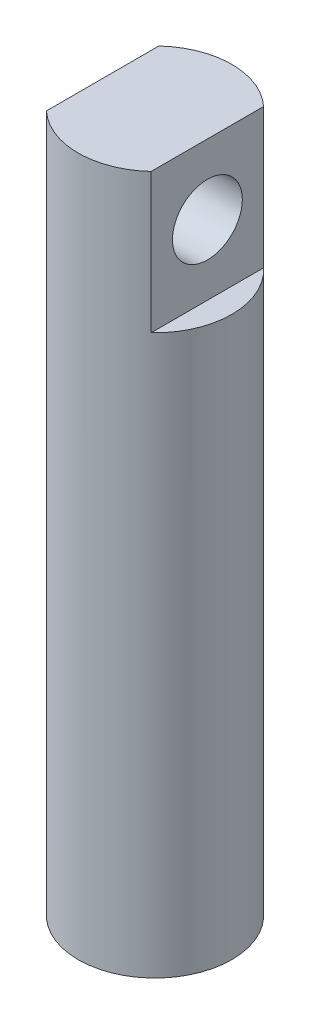
ISO-10303-21;
HEADER;
FILE_DESCRIPTION(('STEP AP214'),'2;1');
FILE_NAME('part.step','',(''),(''),'','','');
FILE_SCHEMA(('AUTOMOTIVE_DESIGN { 1 0 10303 214 1 1 1 1 }'));
ENDSEC;
DATA;
#1=APPLICATION_CONTEXT('core data for automotive mechanical design processes');
#2=APPLICATION_PROTOCOL_DEFINITION('international standard','automotive_design',2000,#1);
#3=PRODUCT_CONTEXT('',#1,'mechanical');
#4=PRODUCT('Part','Part','',(#3));
#5=PRODUCT_RELATED_PRODUCT_CATEGORY('part','',(#4));
#6=PRODUCT_DEFINITION_FORMATION('','',#4);
#7=PRODUCT_DEFINITION_CONTEXT('part definition',#1,'design');
#8=PRODUCT_DEFINITION('design','',#6,#7);
#9=PRODUCT_DEFINITION_SHAPE('','',#8);
#10=(LENGTH_UNIT() NAMED_UNIT(*) SI_UNIT(.MILLI.,.METRE.));
#11=(NAMED_UNIT(*) PLANE_ANGLE_UNIT() SI_UNIT($,.RADIAN.));
#12=(NAMED_UNIT(*) SI_UNIT($,.STERADIAN.) SOLID_ANGLE_UNIT());
#13=UNCERTAINTY_MEASURE_WITH_UNIT(LENGTH_MEASURE(1.E-05),#10,'distance_accuracy_value','');
#14=(GEOMETRIC_REPRESENTATION_CONTEXT(3) GLOBAL_UNCERTAINTY_ASSIGNED_CONTEXT((#13)) GLOBAL_UNIT_ASSIGNED_CONTEXT((#10,
#11,#12)) REPRESENTATION_CONTEXT('',''));
#15=CARTESIAN_POINT('',(0.,0.,0.));
#16=DIRECTION('',(0.,0.,1.));
#17=DIRECTION('',(1.,0.,0.));
#18=AXIS2_PLACEMENT_3D('',#15,#16,#17);
#19=CARTESIAN_POINT('',(0.,40.,0.));
#20=DIRECTION('',(0.,-1.,0.));
#21=DIRECTION('',(0.,0.,-1.));
#22=AXIS2_PLACEMENT_3D('',#19,#20,#21);
#23=CYLINDRICAL_SURFACE('',#22,4.4);
#24=CARTESIAN_POINT('',(0.,40.,0.));
#25=DIRECTION('',(0.,1.,0.));
#26=DIRECTION('',(0.,0.,1.));
#27=AXIS2_PLACEMENT_3D('',#24,#25,#26);
#28=CIRCLE('',#27,4.4);
#29=CARTESIAN_POINT('',(-3.,40.,3.21869538788622));
#30=VERTEX_POINT('',#29);
#31=CARTESIAN_POINT('',(3.,40.,3.21869538788622));
#32=VERTEX_POINT('',#31);
#33=EDGE_CURVE('E90',#30,#32,#28,.T.);
#34=ORIENTED_EDGE('',*,*,#33,.F.);
#35=DIRECTION('',(0.,1.,0.));
#36=VECTOR('',#35,1.);
#37=CARTESIAN_POINT('',(-3.,32.,3.21869538788622));
#38=LINE('',#37,#36);
#39=CARTESIAN_POINT('',(-3.,32.,3.21869538788622));
#40=VERTEX_POINT('',#39);
#41=EDGE_CURVE('E48',#40,#30,#38,.T.);
#42=ORIENTED_EDGE('',*,*,#41,.F.);
#43=CARTESIAN_POINT('',(0.,32.,0.));
#44=DIRECTION('',(0.,-1.,0.));
#45=DIRECTION('',(0.,0.,-1.));
#46=AXIS2_PLACEMENT_3D('',#43,#44,#45);
#47=CIRCLE('',#46,4.4);
#48=CARTESIAN_POINT('',(-3.,32.,-3.21869538788622));
#49=VERTEX_POINT('',#48);
#50=EDGE_CURVE('E11',#40,#49,#47,.T.);
#51=ORIENTED_EDGE('',*,*,#50,.T.);
#52=DIRECTION('',(0.,1.,0.));
#53=VECTOR('',#52,1.);
#54=CARTESIAN_POINT('',(-3.,32.,-3.21869538788622));
#55=LINE('',#54,#53);
#56=CARTESIAN_POINT('',(-3.,40.,-3.21869538788622));
#57=VERTEX_POINT('',#56);
#58=EDGE_CURVE('E74',#49,#57,#55,.T.);
#59=ORIENTED_EDGE('',*,*,#58,.T.);
#60=CARTESIAN_POINT('',(3.,40.,-3.21869538788622));
#61=VERTEX_POINT('',#60);
#62=EDGE_CURVE('E105',#61,#57,#28,.T.);
#63=ORIENTED_EDGE('',*,*,#62,.F.);
#64=DIRECTION('',(0.,1.,0.));
#65=VECTOR('',#64,1.);
#66=CARTESIAN_POINT('',(3.,32.,-3.21869538788622));
#67=LINE('',#66,#65);
#68=CARTESIAN_POINT('',(3.,32.,-3.21869538788622));
#69=VERTEX_POINT('',#68);
#70=EDGE_CURVE('E56',#69,#61,#67,.T.);
#71=ORIENTED_EDGE('',*,*,#70,.F.);
#72=CARTESIAN_POINT('',(0.,32.,0.));
#73=DIRECTION('',(0.,1.,0.));
#74=DIRECTION('',(0.,0.,1.));
#75=AXIS2_PLACEMENT_3D('',#72,#73,#74);
#76=CIRCLE('',#75,4.4);
#77=CARTESIAN_POINT('',(3.,32.,3.21869538788622));
#78=VERTEX_POINT('',#77);
#79=EDGE_CURVE('E41',#78,#69,#76,.T.);
#80=ORIENTED_EDGE('',*,*,#79,.F.);
#81=DIRECTION('',(0.,1.,0.));
#82=VECTOR('',#81,1.);
#83=CARTESIAN_POINT('',(3.,32.,3.21869538788622));
#84=LINE('',#83,#82);
#85=EDGE_CURVE('E100',#78,#32,#84,.T.);
#86=ORIENTED_EDGE('',*,*,#85,.T.);
#87=EDGE_LOOP('',(#34,#42,#51,#59,#63,#71,#80,#86));
#88=FACE_BOUND('',#87,.T.);
#89=CARTESIAN_POINT('',(0.,0.,0.));
#90=DIRECTION('',(0.,1.,0.));
#91=DIRECTION('',(0.,0.,1.));
#92=AXIS2_PLACEMENT_3D('',#89,#90,#91);
#93=CIRCLE('',#92,4.4);
#94=CARTESIAN_POINT('',(0.,0.,4.4));
#95=VERTEX_POINT('',#94);
#96=EDGE_CURVE('E91',#95,#95,#93,.T.);
#97=ORIENTED_EDGE('',*,*,#96,.T.);
#98=EDGE_LOOP('',(#97));
#99=FACE_BOUND('',#98,.T.);
#100=ADVANCED_FACE('F33',(#88,#99),#23,.T.);
#101=CARTESIAN_POINT('',(0.,40.,0.));
#102=DIRECTION('',(0.,1.,0.));
#103=DIRECTION('',(0.,0.,1.));
#104=AXIS2_PLACEMENT_3D('',#101,#102,#103);
#105=PLANE('',#104);
#106=DIRECTION('',(0.,0.,-1.));
#107=VECTOR('',#106,1.);
#108=CARTESIAN_POINT('',(-3.,40.,3.21869538788622));
#109=LINE('',#108,#107);
#110=EDGE_CURVE('E78',#30,#57,#109,.T.);
#111=ORIENTED_EDGE('',*,*,#110,.F.);
#112=ORIENTED_EDGE('',*,*,#33,.T.);
#113=DIRECTION('',(0.,0.,1.));
#114=VECTOR('',#113,1.);
#115=CARTESIAN_POINT('',(3.,40.,3.21869538788622));
#116=LINE('',#115,#114);
#117=EDGE_CURVE('E101',#61,#32,#116,.T.);
#118=ORIENTED_EDGE('',*,*,#117,.F.);
#119=ORIENTED_EDGE('',*,*,#62,.T.);
#120=EDGE_LOOP('',(#111,#112,#118,#119));
#121=FACE_BOUND('',#120,.T.);
#122=ADVANCED_FACE('F110',(#121),#105,.T.);
#123=CARTESIAN_POINT('',(0.,0.,0.));
#124=DIRECTION('',(0.,1.,0.));
#125=DIRECTION('',(0.,0.,1.));
#126=AXIS2_PLACEMENT_3D('',#123,#124,#125);
#127=PLANE('',#126);
#128=ORIENTED_EDGE('',*,*,#96,.F.);
#129=EDGE_LOOP('',(#128));
#130=FACE_BOUND('',#129,.T.);
#131=ADVANCED_FACE('F114',(#130),#127,.F.);
#132=CARTESIAN_POINT('',(0.,32.,0.));
#133=DIRECTION('',(0.,1.,0.));
#134=DIRECTION('',(0.,0.,1.));
#135=AXIS2_PLACEMENT_3D('',#132,#133,#134);
#136=PLANE('',#135);
#137=ORIENTED_EDGE('',*,*,#79,.T.);
#138=DIRECTION('',(0.,0.,1.));
#139=VECTOR('',#138,1.);
#140=CARTESIAN_POINT('',(3.,32.,3.21869538788622));
#141=LINE('',#140,#139);
#142=EDGE_CURVE('E97',#69,#78,#141,.T.);
#143=ORIENTED_EDGE('',*,*,#142,.T.);
#144=EDGE_LOOP('',(#137,#143));
#145=FACE_BOUND('',#144,.T.);
#146=ADVANCED_FACE('F112',(#145),#136,.T.);
#147=CARTESIAN_POINT('',(3.,32.,3.21869538788622));
#148=DIRECTION('',(-1.,0.,0.));
#149=DIRECTION('',(0.,0.,1.));
#150=AXIS2_PLACEMENT_3D('',#147,#148,#149);
#151=PLANE('',#150);
#152=CARTESIAN_POINT('',(3.,36.,0.));
#153=DIRECTION('',(1.,0.,0.));
#154=DIRECTION('',(0.,0.,-1.));
#155=AXIS2_PLACEMENT_3D('',#152,#153,#154);
#156=CIRCLE('',#155,2.);
#157=CARTESIAN_POINT('',(3.,36.,-2.));
#158=VERTEX_POINT('',#157);
#159=EDGE_CURVE('E184',#158,#158,#156,.T.);
#160=ORIENTED_EDGE('',*,*,#159,.F.);
#161=EDGE_LOOP('',(#160));
#162=FACE_BOUND('',#161,.T.);
#163=ORIENTED_EDGE('',*,*,#117,.T.);
#164=ORIENTED_EDGE('',*,*,#85,.F.);
#165=ORIENTED_EDGE('',*,*,#142,.F.);
#166=ORIENTED_EDGE('',*,*,#70,.T.);
#167=EDGE_LOOP('',(#163,#164,#165,#166));
#168=FACE_BOUND('',#167,.T.);
#169=ADVANCED_FACE('F111',(#162,#168),#151,.F.);
#170=CARTESIAN_POINT('',(0.,32.,0.));
#171=DIRECTION('',(0.,-1.,0.));
#172=DIRECTION('',(0.,0.,-1.));
#173=AXIS2_PLACEMENT_3D('',#170,#171,#172);
#174=PLANE('',#173);
#175=DIRECTION('',(0.,0.,-1.));
#176=VECTOR('',#175,1.);
#177=CARTESIAN_POINT('',(-3.,32.,3.21869538788622));
#178=LINE('',#177,#176);
#179=EDGE_CURVE('E77',#40,#49,#178,.T.);
#180=ORIENTED_EDGE('',*,*,#179,.T.);
#181=ORIENTED_EDGE('',*,*,#50,.F.);
#182=EDGE_LOOP('',(#180,#181));
#183=FACE_BOUND('',#182,.T.);
#184=ADVANCED_FACE('F84',(#183),#174,.F.);
#185=CARTESIAN_POINT('',(-3.,32.,3.21869538788622));
#186=DIRECTION('',(1.,0.,0.));
#187=DIRECTION('',(0.,0.,-1.));
#188=AXIS2_PLACEMENT_3D('',#185,#186,#187);
#189=PLANE('',#188);
#190=CARTESIAN_POINT('',(-3.,36.,0.));
#191=DIRECTION('',(1.,0.,0.));
#192=DIRECTION('',(0.,0.,-1.));
#193=AXIS2_PLACEMENT_3D('',#190,#191,#192);
#194=CIRCLE('',#193,2.);
#195=CARTESIAN_POINT('',(-3.,36.,-2.));
#196=VERTEX_POINT('',#195);
#197=EDGE_CURVE('E36',#196,#196,#194,.T.);
#198=ORIENTED_EDGE('',*,*,#197,.T.);
#199=EDGE_LOOP('',(#198));
#200=FACE_BOUND('',#199,.T.);
#201=ORIENTED_EDGE('',*,*,#110,.T.);
#202=ORIENTED_EDGE('',*,*,#58,.F.);
#203=ORIENTED_EDGE('',*,*,#179,.F.);
#204=ORIENTED_EDGE('',*,*,#41,.T.);
#205=EDGE_LOOP('',(#201,#202,#203,#204));
#206=FACE_BOUND('',#205,.T.);
#207=ADVANCED_FACE('F76',(#200,#206),#189,.F.);
#208=CARTESIAN_POINT('',(-4.4,36.,0.));
#209=DIRECTION('',(1.,0.,0.));
#210=DIRECTION('',(0.,0.,-1.));
#211=AXIS2_PLACEMENT_3D('',#208,#209,#210);
#212=CYLINDRICAL_SURFACE('',#211,2.);
#213=ORIENTED_EDGE('',*,*,#159,.T.);
#214=EDGE_LOOP('',(#213));
#215=FACE_BOUND('',#214,.T.);
#216=ORIENTED_EDGE('',*,*,#197,.F.);
#217=EDGE_LOOP('',(#216));
#218=FACE_BOUND('',#217,.T.);
#219=ADVANCED_FACE('F167',(#215,#218),#212,.F.);
#220=CLOSED_SHELL('',(#100,#122,#131,#146,#169,#184,#207,#219));
#221=MANIFOLD_SOLID_BREP('B2',#220);
#222=ADVANCED_BREP_SHAPE_REPRESENTATION('',(#18,#221),#14);
#223=SHAPE_DEFINITION_REPRESENTATION(#9,#222);
ENDSEC;
END-ISO-10303-21;
